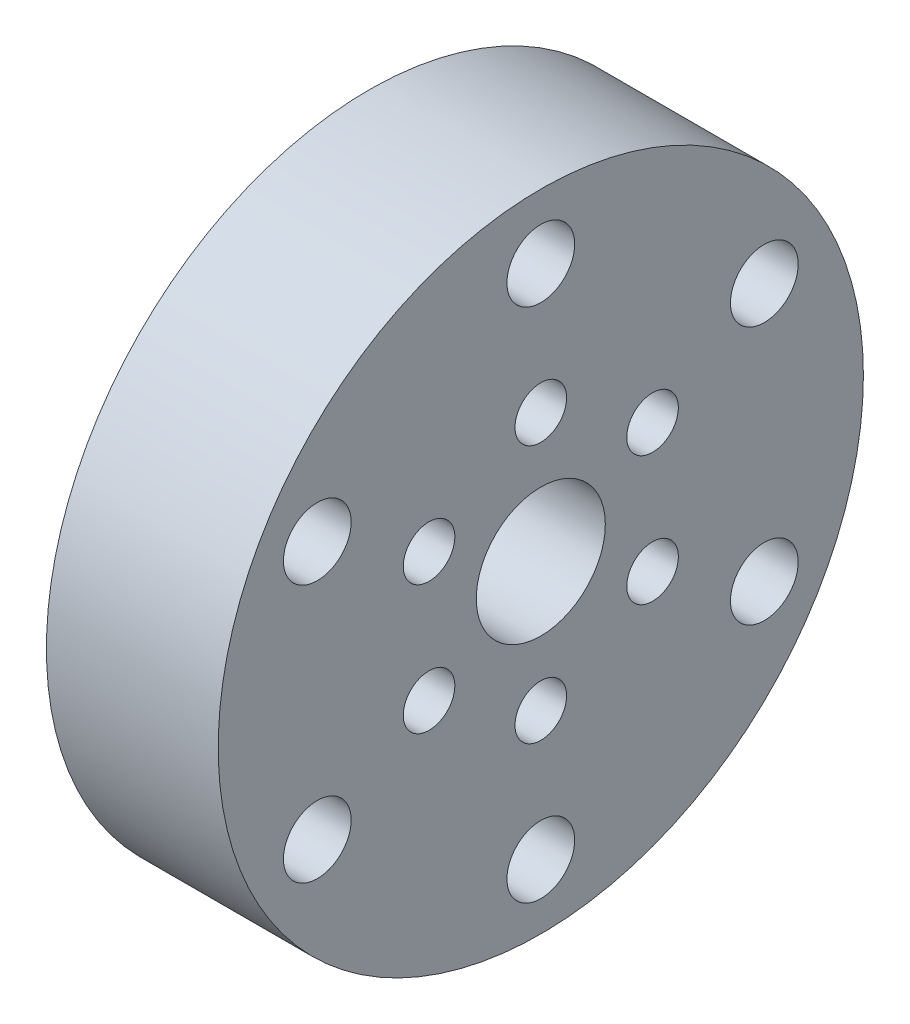
ISO-10303-21;
HEADER;
FILE_DESCRIPTION(('STEP AP214'),'2;1');
FILE_NAME('part.step','',(''),(''),'','','');
FILE_SCHEMA(('AUTOMOTIVE_DESIGN { 1 0 10303 214 1 1 1 1 }'));
ENDSEC;
DATA;
#1=APPLICATION_CONTEXT('core data for automotive mechanical design processes');
#2=APPLICATION_PROTOCOL_DEFINITION('international standard','automotive_design',2000,#1);
#3=PRODUCT_CONTEXT('',#1,'mechanical');
#4=PRODUCT('Part','Part','',(#3));
#5=PRODUCT_RELATED_PRODUCT_CATEGORY('part','',(#4));
#6=PRODUCT_DEFINITION_FORMATION('','',#4);
#7=PRODUCT_DEFINITION_CONTEXT('part definition',#1,'design');
#8=PRODUCT_DEFINITION('design','',#6,#7);
#9=PRODUCT_DEFINITION_SHAPE('','',#8);
#10=(LENGTH_UNIT() NAMED_UNIT(*) SI_UNIT(.MILLI.,.METRE.));
#11=(NAMED_UNIT(*) PLANE_ANGLE_UNIT() SI_UNIT($,.RADIAN.));
#12=(NAMED_UNIT(*) SI_UNIT($,.STERADIAN.) SOLID_ANGLE_UNIT());
#13=UNCERTAINTY_MEASURE_WITH_UNIT(LENGTH_MEASURE(1.E-05),#10,'distance_accuracy_value','');
#14=(GEOMETRIC_REPRESENTATION_CONTEXT(3) GLOBAL_UNCERTAINTY_ASSIGNED_CONTEXT((#13)) GLOBAL_UNIT_ASSIGNED_CONTEXT((#10,
#11,#12)) REPRESENTATION_CONTEXT('',''));
#15=CARTESIAN_POINT('',(0.,0.,0.));
#16=DIRECTION('',(0.,0.,1.));
#17=DIRECTION('',(1.,0.,0.));
#18=AXIS2_PLACEMENT_3D('',#15,#16,#17);
#19=CARTESIAN_POINT('',(10.65,0.,0.));
#20=DIRECTION('',(1.,0.,0.));
#21=DIRECTION('',(0.,0.,-1.));
#22=AXIS2_PLACEMENT_3D('',#19,#20,#21);
#23=PLANE('',#22);
#24=CARTESIAN_POINT('',(10.65,3.99999999999999,6.92820323027552));
#25=DIRECTION('',(1.,0.,0.));
#26=DIRECTION('',(0.,0.,-1.));
#27=AXIS2_PLACEMENT_3D('',#24,#25,#26);
#28=CIRCLE('',#27,1.6);
#29=CARTESIAN_POINT('',(10.65,3.99999999999999,5.32820323027552));
#30=VERTEX_POINT('',#29);
#31=EDGE_CURVE('E145',#30,#30,#28,.T.);
#32=ORIENTED_EDGE('',*,*,#31,.F.);
#33=EDGE_LOOP('',(#32));
#34=FACE_BOUND('',#33,.T.);
#35=CARTESIAN_POINT('',(10.65,-8.,0.));
#36=DIRECTION('',(1.,0.,0.));
#37=DIRECTION('',(0.,0.,-1.));
#38=AXIS2_PLACEMENT_3D('',#35,#36,#37);
#39=CIRCLE('',#38,1.6);
#40=CARTESIAN_POINT('',(10.65,-8.,-1.60000000000001));
#41=VERTEX_POINT('',#40);
#42=EDGE_CURVE('E133',#41,#41,#39,.T.);
#43=ORIENTED_EDGE('',*,*,#42,.F.);
#44=EDGE_LOOP('',(#43));
#45=FACE_BOUND('',#44,.T.);
#46=CARTESIAN_POINT('',(10.65,4.,-6.92820323027551));
#47=DIRECTION('',(1.,0.,0.));
#48=DIRECTION('',(0.,0.,-1.));
#49=AXIS2_PLACEMENT_3D('',#46,#47,#48);
#50=CIRCLE('',#49,1.6);
#51=CARTESIAN_POINT('',(10.65,4.,-8.52820323027551));
#52=VERTEX_POINT('',#51);
#53=EDGE_CURVE('E121',#52,#52,#50,.T.);
#54=ORIENTED_EDGE('',*,*,#53,.F.);
#55=EDGE_LOOP('',(#54));
#56=FACE_BOUND('',#55,.T.);
#57=CARTESIAN_POINT('',(10.65,7.99999999999999,13.856406460551));
#58=DIRECTION('',(1.,0.,0.));
#59=DIRECTION('',(0.,0.,-1.));
#60=AXIS2_PLACEMENT_3D('',#57,#58,#59);
#61=CIRCLE('',#60,2.10000000000019);
#62=CARTESIAN_POINT('',(10.65,7.99999999999999,11.7564064605508));
#63=VERTEX_POINT('',#62);
#64=EDGE_CURVE('E109',#63,#63,#61,.T.);
#65=ORIENTED_EDGE('',*,*,#64,.F.);
#66=EDGE_LOOP('',(#65));
#67=FACE_BOUND('',#66,.T.);
#68=CARTESIAN_POINT('',(10.65,-16.,0.));
#69=DIRECTION('',(1.,0.,0.));
#70=DIRECTION('',(0.,0.,-1.));
#71=AXIS2_PLACEMENT_3D('',#68,#69,#70);
#72=CIRCLE('',#71,2.10000000000011);
#73=CARTESIAN_POINT('',(10.65,-16.,-2.10000000000011));
#74=VERTEX_POINT('',#73);
#75=EDGE_CURVE('E97',#74,#74,#72,.T.);
#76=ORIENTED_EDGE('',*,*,#75,.F.);
#77=EDGE_LOOP('',(#76));
#78=FACE_BOUND('',#77,.T.);
#79=CARTESIAN_POINT('',(10.65,0.,0.));
#80=DIRECTION('',(1.,0.,0.));
#81=DIRECTION('',(0.,0.,-1.));
#82=AXIS2_PLACEMENT_3D('',#79,#80,#81);
#83=CIRCLE('',#82,4.);
#84=CARTESIAN_POINT('',(10.65,0.,-4.));
#85=VERTEX_POINT('',#84);
#86=EDGE_CURVE('E85',#85,#85,#83,.T.);
#87=ORIENTED_EDGE('',*,*,#86,.F.);
#88=EDGE_LOOP('',(#87));
#89=FACE_BOUND('',#88,.T.);
#90=CARTESIAN_POINT('',(10.65,16.,0.));
#91=DIRECTION('',(1.,0.,0.));
#92=DIRECTION('',(0.,0.,-1.));
#93=AXIS2_PLACEMENT_3D('',#90,#91,#92);
#94=CIRCLE('',#93,2.1);
#95=CARTESIAN_POINT('',(10.65,16.,-2.1));
#96=VERTEX_POINT('',#95);
#97=EDGE_CURVE('E74',#96,#96,#94,.T.);
#98=ORIENTED_EDGE('',*,*,#97,.F.);
#99=EDGE_LOOP('',(#98));
#100=FACE_BOUND('',#99,.T.);
#101=CARTESIAN_POINT('',(10.65,8.00000000000001,-13.856406460551));
#102=DIRECTION('',(1.,0.,0.));
#103=DIRECTION('',(0.,0.,-1.));
#104=AXIS2_PLACEMENT_3D('',#101,#102,#103);
#105=CIRCLE('',#104,2.10000000000004);
#106=CARTESIAN_POINT('',(10.65,8.00000000000001,-15.9564064605511));
#107=VERTEX_POINT('',#106);
#108=EDGE_CURVE('E79',#107,#107,#105,.T.);
#109=ORIENTED_EDGE('',*,*,#108,.F.);
#110=EDGE_LOOP('',(#109));
#111=FACE_BOUND('',#110,.T.);
#112=CARTESIAN_POINT('',(10.65,-8.,-13.856406460551));
#113=DIRECTION('',(1.,0.,0.));
#114=DIRECTION('',(0.,0.,-1.));
#115=AXIS2_PLACEMENT_3D('',#112,#113,#114);
#116=CIRCLE('',#115,2.10000000000008);
#117=CARTESIAN_POINT('',(10.65,-8.,-15.9564064605511));
#118=VERTEX_POINT('',#117);
#119=EDGE_CURVE('E91',#118,#118,#116,.T.);
#120=ORIENTED_EDGE('',*,*,#119,.F.);
#121=EDGE_LOOP('',(#120));
#122=FACE_BOUND('',#121,.T.);
#123=CARTESIAN_POINT('',(10.65,-8.00000000000001,13.856406460551));
#124=DIRECTION('',(1.,0.,0.));
#125=DIRECTION('',(0.,0.,-1.));
#126=AXIS2_PLACEMENT_3D('',#123,#124,#125);
#127=CIRCLE('',#126,2.10000000000015);
#128=CARTESIAN_POINT('',(10.65,-8.00000000000001,11.7564064605509));
#129=VERTEX_POINT('',#128);
#130=EDGE_CURVE('E103',#129,#129,#127,.T.);
#131=ORIENTED_EDGE('',*,*,#130,.F.);
#132=EDGE_LOOP('',(#131));
#133=FACE_BOUND('',#132,.T.);
#134=CARTESIAN_POINT('',(10.65,8.,0.));
#135=DIRECTION('',(1.,0.,0.));
#136=DIRECTION('',(0.,0.,-1.));
#137=AXIS2_PLACEMENT_3D('',#134,#135,#136);
#138=CIRCLE('',#137,1.6);
#139=CARTESIAN_POINT('',(10.65,8.,-1.6));
#140=VERTEX_POINT('',#139);
#141=EDGE_CURVE('E115',#140,#140,#138,.T.);
#142=ORIENTED_EDGE('',*,*,#141,.F.);
#143=EDGE_LOOP('',(#142));
#144=FACE_BOUND('',#143,.T.);
#145=CARTESIAN_POINT('',(10.65,-3.99999999999999,-6.92820323027551));
#146=DIRECTION('',(1.,0.,0.));
#147=DIRECTION('',(0.,0.,-1.));
#148=AXIS2_PLACEMENT_3D('',#145,#146,#147);
#149=CIRCLE('',#148,1.6);
#150=CARTESIAN_POINT('',(10.65,-3.99999999999999,-8.52820323027551));
#151=VERTEX_POINT('',#150);
#152=EDGE_CURVE('E127',#151,#151,#149,.T.);
#153=ORIENTED_EDGE('',*,*,#152,.F.);
#154=EDGE_LOOP('',(#153));
#155=FACE_BOUND('',#154,.T.);
#156=CARTESIAN_POINT('',(10.65,-4.00000000000001,6.9282032302755));
#157=DIRECTION('',(1.,0.,0.));
#158=DIRECTION('',(0.,0.,-1.));
#159=AXIS2_PLACEMENT_3D('',#156,#157,#158);
#160=CIRCLE('',#159,1.6);
#161=CARTESIAN_POINT('',(10.65,-4.00000000000001,5.3282032302755));
#162=VERTEX_POINT('',#161);
#163=EDGE_CURVE('E139',#162,#162,#160,.T.);
#164=ORIENTED_EDGE('',*,*,#163,.F.);
#165=EDGE_LOOP('',(#164));
#166=FACE_BOUND('',#165,.T.);
#167=CARTESIAN_POINT('',(10.65,0.,0.));
#168=DIRECTION('',(1.,0.,0.));
#169=DIRECTION('',(0.,0.,-1.));
#170=AXIS2_PLACEMENT_3D('',#167,#168,#169);
#171=CIRCLE('',#170,20.);
#172=CARTESIAN_POINT('',(10.65,0.,-20.));
#173=VERTEX_POINT('',#172);
#174=EDGE_CURVE('E11',#173,#173,#171,.T.);
#175=ORIENTED_EDGE('',*,*,#174,.T.);
#176=EDGE_LOOP('',(#175));
#177=FACE_BOUND('',#176,.T.);
#178=ADVANCED_FACE('F63',(#34,#45,#56,#67,#78,#89,#100,#111,#122,#133,#144,#155,#166,#177),#23,.T.);
#179=CARTESIAN_POINT('',(10.65,0.,0.));
#180=DIRECTION('',(-1.,0.,0.));
#181=DIRECTION('',(0.,0.,1.));
#182=AXIS2_PLACEMENT_3D('',#179,#180,#181);
#183=CYLINDRICAL_SURFACE('',#182,20.);
#184=ORIENTED_EDGE('',*,*,#174,.F.);
#185=EDGE_LOOP('',(#184));
#186=FACE_BOUND('',#185,.T.);
#187=CARTESIAN_POINT('',(0.,0.,0.));
#188=DIRECTION('',(1.,0.,0.));
#189=DIRECTION('',(0.,0.,-1.));
#190=AXIS2_PLACEMENT_3D('',#187,#188,#189);
#191=CIRCLE('',#190,20.);
#192=CARTESIAN_POINT('',(0.,0.,-20.));
#193=VERTEX_POINT('',#192);
#194=EDGE_CURVE('E67',#193,#193,#191,.T.);
#195=ORIENTED_EDGE('',*,*,#194,.T.);
#196=EDGE_LOOP('',(#195));
#197=FACE_BOUND('',#196,.T.);
#198=ADVANCED_FACE('F65',(#186,#197),#183,.T.);
#199=CARTESIAN_POINT('',(0.,0.,0.));
#200=DIRECTION('',(1.,0.,0.));
#201=DIRECTION('',(0.,0.,-1.));
#202=AXIS2_PLACEMENT_3D('',#199,#200,#201);
#203=PLANE('',#202);
#204=ORIENTED_EDGE('',*,*,#194,.F.);
#205=EDGE_LOOP('',(#204));
#206=FACE_BOUND('',#205,.T.);
#207=CARTESIAN_POINT('',(0.,16.,0.));
#208=DIRECTION('',(1.,0.,0.));
#209=DIRECTION('',(0.,0.,-1.));
#210=AXIS2_PLACEMENT_3D('',#207,#208,#209);
#211=CIRCLE('',#210,2.1);
#212=CARTESIAN_POINT('',(0.,16.,-2.1));
#213=VERTEX_POINT('',#212);
#214=EDGE_CURVE('E76',#213,#213,#211,.T.);
#215=ORIENTED_EDGE('',*,*,#214,.T.);
#216=EDGE_LOOP('',(#215));
#217=FACE_BOUND('',#216,.T.);
#218=CARTESIAN_POINT('',(0.,8.00000000000001,-13.856406460551));
#219=DIRECTION('',(1.,0.,0.));
#220=DIRECTION('',(0.,0.,-1.));
#221=AXIS2_PLACEMENT_3D('',#218,#219,#220);
#222=CIRCLE('',#221,2.10000000000004);
#223=CARTESIAN_POINT('',(0.,8.00000000000001,-15.9564064605511));
#224=VERTEX_POINT('',#223);
#225=EDGE_CURVE('E82',#224,#224,#222,.T.);
#226=ORIENTED_EDGE('',*,*,#225,.T.);
#227=EDGE_LOOP('',(#226));
#228=FACE_BOUND('',#227,.T.);
#229=CARTESIAN_POINT('',(0.,0.,0.));
#230=DIRECTION('',(1.,0.,0.));
#231=DIRECTION('',(0.,0.,-1.));
#232=AXIS2_PLACEMENT_3D('',#229,#230,#231);
#233=CIRCLE('',#232,4.);
#234=CARTESIAN_POINT('',(0.,0.,-4.));
#235=VERTEX_POINT('',#234);
#236=EDGE_CURVE('E88',#235,#235,#233,.T.);
#237=ORIENTED_EDGE('',*,*,#236,.T.);
#238=EDGE_LOOP('',(#237));
#239=FACE_BOUND('',#238,.T.);
#240=CARTESIAN_POINT('',(0.,-8.,-13.856406460551));
#241=DIRECTION('',(1.,0.,0.));
#242=DIRECTION('',(0.,0.,-1.));
#243=AXIS2_PLACEMENT_3D('',#240,#241,#242);
#244=CIRCLE('',#243,2.10000000000008);
#245=CARTESIAN_POINT('',(0.,-8.,-15.9564064605511));
#246=VERTEX_POINT('',#245);
#247=EDGE_CURVE('E94',#246,#246,#244,.T.);
#248=ORIENTED_EDGE('',*,*,#247,.T.);
#249=EDGE_LOOP('',(#248));
#250=FACE_BOUND('',#249,.T.);
#251=CARTESIAN_POINT('',(0.,-16.,0.));
#252=DIRECTION('',(1.,0.,0.));
#253=DIRECTION('',(0.,0.,-1.));
#254=AXIS2_PLACEMENT_3D('',#251,#252,#253);
#255=CIRCLE('',#254,2.10000000000011);
#256=CARTESIAN_POINT('',(0.,-16.,-2.10000000000011));
#257=VERTEX_POINT('',#256);
#258=EDGE_CURVE('E100',#257,#257,#255,.T.);
#259=ORIENTED_EDGE('',*,*,#258,.T.);
#260=EDGE_LOOP('',(#259));
#261=FACE_BOUND('',#260,.T.);
#262=CARTESIAN_POINT('',(0.,-8.00000000000001,13.856406460551));
#263=DIRECTION('',(1.,0.,0.));
#264=DIRECTION('',(0.,0.,-1.));
#265=AXIS2_PLACEMENT_3D('',#262,#263,#264);
#266=CIRCLE('',#265,2.10000000000015);
#267=CARTESIAN_POINT('',(0.,-8.00000000000001,11.7564064605509));
#268=VERTEX_POINT('',#267);
#269=EDGE_CURVE('E106',#268,#268,#266,.T.);
#270=ORIENTED_EDGE('',*,*,#269,.T.);
#271=EDGE_LOOP('',(#270));
#272=FACE_BOUND('',#271,.T.);
#273=CARTESIAN_POINT('',(0.,7.99999999999999,13.856406460551));
#274=DIRECTION('',(1.,0.,0.));
#275=DIRECTION('',(0.,0.,-1.));
#276=AXIS2_PLACEMENT_3D('',#273,#274,#275);
#277=CIRCLE('',#276,2.10000000000019);
#278=CARTESIAN_POINT('',(0.,7.99999999999999,11.7564064605508));
#279=VERTEX_POINT('',#278);
#280=EDGE_CURVE('E112',#279,#279,#277,.T.);
#281=ORIENTED_EDGE('',*,*,#280,.T.);
#282=EDGE_LOOP('',(#281));
#283=FACE_BOUND('',#282,.T.);
#284=CARTESIAN_POINT('',(0.,8.,0.));
#285=DIRECTION('',(1.,0.,0.));
#286=DIRECTION('',(0.,0.,-1.));
#287=AXIS2_PLACEMENT_3D('',#284,#285,#286);
#288=CIRCLE('',#287,1.6);
#289=CARTESIAN_POINT('',(0.,8.,-1.6));
#290=VERTEX_POINT('',#289);
#291=EDGE_CURVE('E118',#290,#290,#288,.T.);
#292=ORIENTED_EDGE('',*,*,#291,.T.);
#293=EDGE_LOOP('',(#292));
#294=FACE_BOUND('',#293,.T.);
#295=CARTESIAN_POINT('',(0.,4.,-6.92820323027551));
#296=DIRECTION('',(1.,0.,0.));
#297=DIRECTION('',(0.,0.,-1.));
#298=AXIS2_PLACEMENT_3D('',#295,#296,#297);
#299=CIRCLE('',#298,1.6);
#300=CARTESIAN_POINT('',(0.,4.,-8.52820323027551));
#301=VERTEX_POINT('',#300);
#302=EDGE_CURVE('E124',#301,#301,#299,.T.);
#303=ORIENTED_EDGE('',*,*,#302,.T.);
#304=EDGE_LOOP('',(#303));
#305=FACE_BOUND('',#304,.T.);
#306=CARTESIAN_POINT('',(0.,-3.99999999999999,-6.92820323027551));
#307=DIRECTION('',(1.,0.,0.));
#308=DIRECTION('',(0.,0.,-1.));
#309=AXIS2_PLACEMENT_3D('',#306,#307,#308);
#310=CIRCLE('',#309,1.6);
#311=CARTESIAN_POINT('',(0.,-3.99999999999999,-8.52820323027551));
#312=VERTEX_POINT('',#311);
#313=EDGE_CURVE('E130',#312,#312,#310,.T.);
#314=ORIENTED_EDGE('',*,*,#313,.T.);
#315=EDGE_LOOP('',(#314));
#316=FACE_BOUND('',#315,.T.);
#317=CARTESIAN_POINT('',(0.,-8.,0.));
#318=DIRECTION('',(1.,0.,0.));
#319=DIRECTION('',(0.,0.,-1.));
#320=AXIS2_PLACEMENT_3D('',#317,#318,#319);
#321=CIRCLE('',#320,1.6);
#322=CARTESIAN_POINT('',(0.,-8.,-1.60000000000001));
#323=VERTEX_POINT('',#322);
#324=EDGE_CURVE('E136',#323,#323,#321,.T.);
#325=ORIENTED_EDGE('',*,*,#324,.T.);
#326=EDGE_LOOP('',(#325));
#327=FACE_BOUND('',#326,.T.);
#328=CARTESIAN_POINT('',(0.,-4.00000000000001,6.9282032302755));
#329=DIRECTION('',(1.,0.,0.));
#330=DIRECTION('',(0.,0.,-1.));
#331=AXIS2_PLACEMENT_3D('',#328,#329,#330);
#332=CIRCLE('',#331,1.6);
#333=CARTESIAN_POINT('',(0.,-4.00000000000001,5.3282032302755));
#334=VERTEX_POINT('',#333);
#335=EDGE_CURVE('E142',#334,#334,#332,.T.);
#336=ORIENTED_EDGE('',*,*,#335,.T.);
#337=EDGE_LOOP('',(#336));
#338=FACE_BOUND('',#337,.T.);
#339=CARTESIAN_POINT('',(0.,3.99999999999999,6.92820323027552));
#340=DIRECTION('',(1.,0.,0.));
#341=DIRECTION('',(0.,0.,-1.));
#342=AXIS2_PLACEMENT_3D('',#339,#340,#341);
#343=CIRCLE('',#342,1.6);
#344=CARTESIAN_POINT('',(0.,3.99999999999999,5.32820323027552));
#345=VERTEX_POINT('',#344);
#346=EDGE_CURVE('E148',#345,#345,#343,.T.);
#347=ORIENTED_EDGE('',*,*,#346,.T.);
#348=EDGE_LOOP('',(#347));
#349=FACE_BOUND('',#348,.T.);
#350=ADVANCED_FACE('F191',(#206,#217,#228,#239,#250,#261,#272,#283,#294,#305,#316,#327,#338,
#349),#203,.F.);
#351=CARTESIAN_POINT('',(10.65,16.,0.));
#352=DIRECTION('',(-1.,0.,0.));
#353=DIRECTION('',(0.,0.,1.));
#354=AXIS2_PLACEMENT_3D('',#351,#352,#353);
#355=CYLINDRICAL_SURFACE('',#354,2.1);
#356=ORIENTED_EDGE('',*,*,#97,.T.);
#357=EDGE_LOOP('',(#356));
#358=FACE_BOUND('',#357,.T.);
#359=ORIENTED_EDGE('',*,*,#214,.F.);
#360=EDGE_LOOP('',(#359));
#361=FACE_BOUND('',#360,.T.);
#362=ADVANCED_FACE('F194',(#358,#361),#355,.F.);
#363=CARTESIAN_POINT('',(10.65,8.00000000000001,-13.856406460551));
#364=DIRECTION('',(-1.,0.,0.));
#365=DIRECTION('',(0.,0.,1.));
#366=AXIS2_PLACEMENT_3D('',#363,#364,#365);
#367=CYLINDRICAL_SURFACE('',#366,2.10000000000004);
#368=ORIENTED_EDGE('',*,*,#108,.T.);
#369=EDGE_LOOP('',(#368));
#370=FACE_BOUND('',#369,.T.);
#371=ORIENTED_EDGE('',*,*,#225,.F.);
#372=EDGE_LOOP('',(#371));
#373=FACE_BOUND('',#372,.T.);
#374=ADVANCED_FACE('F236',(#370,#373),#367,.F.);
#375=CARTESIAN_POINT('',(10.65,0.,0.));
#376=DIRECTION('',(-1.,0.,0.));
#377=DIRECTION('',(0.,0.,1.));
#378=AXIS2_PLACEMENT_3D('',#375,#376,#377);
#379=CYLINDRICAL_SURFACE('',#378,4.);
#380=ORIENTED_EDGE('',*,*,#86,.T.);
#381=EDGE_LOOP('',(#380));
#382=FACE_BOUND('',#381,.T.);
#383=ORIENTED_EDGE('',*,*,#236,.F.);
#384=EDGE_LOOP('',(#383));
#385=FACE_BOUND('',#384,.T.);
#386=ADVANCED_FACE('F232',(#382,#385),#379,.F.);
#387=CARTESIAN_POINT('',(10.65,-8.,-13.856406460551));
#388=DIRECTION('',(-1.,0.,0.));
#389=DIRECTION('',(0.,0.,1.));
#390=AXIS2_PLACEMENT_3D('',#387,#388,#389);
#391=CYLINDRICAL_SURFACE('',#390,2.10000000000008);
#392=ORIENTED_EDGE('',*,*,#119,.T.);
#393=EDGE_LOOP('',(#392));
#394=FACE_BOUND('',#393,.T.);
#395=ORIENTED_EDGE('',*,*,#247,.F.);
#396=EDGE_LOOP('',(#395));
#397=FACE_BOUND('',#396,.T.);
#398=ADVANCED_FACE('F228',(#394,#397),#391,.F.);
#399=CARTESIAN_POINT('',(10.65,-16.,0.));
#400=DIRECTION('',(-1.,0.,0.));
#401=DIRECTION('',(0.,0.,1.));
#402=AXIS2_PLACEMENT_3D('',#399,#400,#401);
#403=CYLINDRICAL_SURFACE('',#402,2.10000000000011);
#404=ORIENTED_EDGE('',*,*,#75,.T.);
#405=EDGE_LOOP('',(#404));
#406=FACE_BOUND('',#405,.T.);
#407=ORIENTED_EDGE('',*,*,#258,.F.);
#408=EDGE_LOOP('',(#407));
#409=FACE_BOUND('',#408,.T.);
#410=ADVANCED_FACE('F224',(#406,#409),#403,.F.);
#411=CARTESIAN_POINT('',(10.65,-8.00000000000001,13.856406460551));
#412=DIRECTION('',(-1.,0.,0.));
#413=DIRECTION('',(0.,0.,1.));
#414=AXIS2_PLACEMENT_3D('',#411,#412,#413);
#415=CYLINDRICAL_SURFACE('',#414,2.10000000000015);
#416=ORIENTED_EDGE('',*,*,#130,.T.);
#417=EDGE_LOOP('',(#416));
#418=FACE_BOUND('',#417,.T.);
#419=ORIENTED_EDGE('',*,*,#269,.F.);
#420=EDGE_LOOP('',(#419));
#421=FACE_BOUND('',#420,.T.);
#422=ADVANCED_FACE('F220',(#418,#421),#415,.F.);
#423=CARTESIAN_POINT('',(10.65,7.99999999999999,13.856406460551));
#424=DIRECTION('',(-1.,0.,0.));
#425=DIRECTION('',(0.,0.,1.));
#426=AXIS2_PLACEMENT_3D('',#423,#424,#425);
#427=CYLINDRICAL_SURFACE('',#426,2.10000000000019);
#428=ORIENTED_EDGE('',*,*,#64,.T.);
#429=EDGE_LOOP('',(#428));
#430=FACE_BOUND('',#429,.T.);
#431=ORIENTED_EDGE('',*,*,#280,.F.);
#432=EDGE_LOOP('',(#431));
#433=FACE_BOUND('',#432,.T.);
#434=ADVANCED_FACE('F216',(#430,#433),#427,.F.);
#435=CARTESIAN_POINT('',(10.65,8.,0.));
#436=DIRECTION('',(-1.,0.,0.));
#437=DIRECTION('',(0.,0.,1.));
#438=AXIS2_PLACEMENT_3D('',#435,#436,#437);
#439=CYLINDRICAL_SURFACE('',#438,1.6);
#440=ORIENTED_EDGE('',*,*,#141,.T.);
#441=EDGE_LOOP('',(#440));
#442=FACE_BOUND('',#441,.T.);
#443=ORIENTED_EDGE('',*,*,#291,.F.);
#444=EDGE_LOOP('',(#443));
#445=FACE_BOUND('',#444,.T.);
#446=ADVANCED_FACE('F212',(#442,#445),#439,.F.);
#447=CARTESIAN_POINT('',(10.65,4.,-6.92820323027551));
#448=DIRECTION('',(-1.,0.,0.));
#449=DIRECTION('',(0.,0.,1.));
#450=AXIS2_PLACEMENT_3D('',#447,#448,#449);
#451=CYLINDRICAL_SURFACE('',#450,1.6);
#452=ORIENTED_EDGE('',*,*,#53,.T.);
#453=EDGE_LOOP('',(#452));
#454=FACE_BOUND('',#453,.T.);
#455=ORIENTED_EDGE('',*,*,#302,.F.);
#456=EDGE_LOOP('',(#455));
#457=FACE_BOUND('',#456,.T.);
#458=ADVANCED_FACE('F208',(#454,#457),#451,.F.);
#459=CARTESIAN_POINT('',(10.65,-3.99999999999999,-6.92820323027551));
#460=DIRECTION('',(-1.,0.,0.));
#461=DIRECTION('',(0.,0.,1.));
#462=AXIS2_PLACEMENT_3D('',#459,#460,#461);
#463=CYLINDRICAL_SURFACE('',#462,1.6);
#464=ORIENTED_EDGE('',*,*,#152,.T.);
#465=EDGE_LOOP('',(#464));
#466=FACE_BOUND('',#465,.T.);
#467=ORIENTED_EDGE('',*,*,#313,.F.);
#468=EDGE_LOOP('',(#467));
#469=FACE_BOUND('',#468,.T.);
#470=ADVANCED_FACE('F204',(#466,#469),#463,.F.);
#471=CARTESIAN_POINT('',(10.65,-8.,0.));
#472=DIRECTION('',(-1.,0.,0.));
#473=DIRECTION('',(0.,0.,1.));
#474=AXIS2_PLACEMENT_3D('',#471,#472,#473);
#475=CYLINDRICAL_SURFACE('',#474,1.6);
#476=ORIENTED_EDGE('',*,*,#42,.T.);
#477=EDGE_LOOP('',(#476));
#478=FACE_BOUND('',#477,.T.);
#479=ORIENTED_EDGE('',*,*,#324,.F.);
#480=EDGE_LOOP('',(#479));
#481=FACE_BOUND('',#480,.T.);
#482=ADVANCED_FACE('F187',(#478,#481),#475,.F.);
#483=CARTESIAN_POINT('',(10.65,-4.00000000000001,6.9282032302755));
#484=DIRECTION('',(-1.,0.,0.));
#485=DIRECTION('',(0.,0.,1.));
#486=AXIS2_PLACEMENT_3D('',#483,#484,#485);
#487=CYLINDRICAL_SURFACE('',#486,1.6);
#488=ORIENTED_EDGE('',*,*,#163,.T.);
#489=EDGE_LOOP('',(#488));
#490=FACE_BOUND('',#489,.T.);
#491=ORIENTED_EDGE('',*,*,#335,.F.);
#492=EDGE_LOOP('',(#491));
#493=FACE_BOUND('',#492,.T.);
#494=ADVANCED_FACE('F184',(#490,#493),#487,.F.);
#495=CARTESIAN_POINT('',(10.65,3.99999999999999,6.92820323027552));
#496=DIRECTION('',(-1.,0.,0.));
#497=DIRECTION('',(0.,0.,1.));
#498=AXIS2_PLACEMENT_3D('',#495,#496,#497);
#499=CYLINDRICAL_SURFACE('',#498,1.6);
#500=ORIENTED_EDGE('',*,*,#31,.T.);
#501=EDGE_LOOP('',(#500));
#502=FACE_BOUND('',#501,.T.);
#503=ORIENTED_EDGE('',*,*,#346,.F.);
#504=EDGE_LOOP('',(#503));
#505=FACE_BOUND('',#504,.T.);
#506=ADVANCED_FACE('F154',(#502,#505),#499,.F.);
#507=CLOSED_SHELL('',(#178,#198,#350,#362,#374,#386,#398,#410,#422,#434,#446,#458,#470,#482,
#494,#506));
#508=MANIFOLD_SOLID_BREP('B2',#507);
#509=ADVANCED_BREP_SHAPE_REPRESENTATION('',(#18,#508),#14);
#510=SHAPE_DEFINITION_REPRESENTATION(#9,#509);
ENDSEC;
END-ISO-10303-21;
